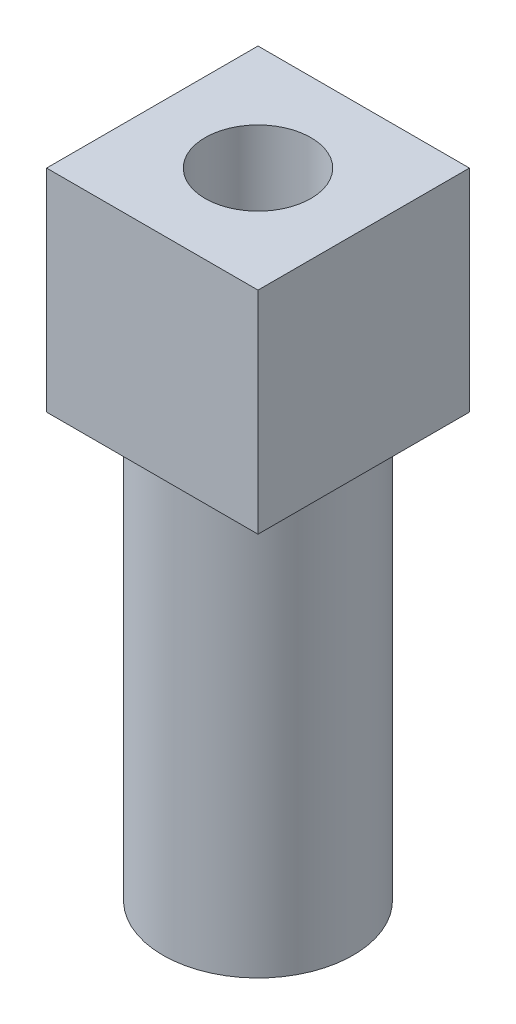
ISO-10303-21;
HEADER;
FILE_DESCRIPTION(('STEP AP214'),'2;1');
FILE_NAME('part.step','',(''),(''),'','','');
FILE_SCHEMA(('AUTOMOTIVE_DESIGN { 1 0 10303 214 1 1 1 1 }'));
ENDSEC;
DATA;
#1=APPLICATION_CONTEXT('core data for automotive mechanical design processes');
#2=APPLICATION_PROTOCOL_DEFINITION('international standard','automotive_design',2000,#1);
#3=PRODUCT_CONTEXT('',#1,'mechanical');
#4=PRODUCT('Part','Part','',(#3));
#5=PRODUCT_RELATED_PRODUCT_CATEGORY('part','',(#4));
#6=PRODUCT_DEFINITION_FORMATION('','',#4);
#7=PRODUCT_DEFINITION_CONTEXT('part definition',#1,'design');
#8=PRODUCT_DEFINITION('design','',#6,#7);
#9=PRODUCT_DEFINITION_SHAPE('','',#8);
#10=(LENGTH_UNIT() NAMED_UNIT(*) SI_UNIT(.MILLI.,.METRE.));
#11=(NAMED_UNIT(*) PLANE_ANGLE_UNIT() SI_UNIT($,.RADIAN.));
#12=(NAMED_UNIT(*) SI_UNIT($,.STERADIAN.) SOLID_ANGLE_UNIT());
#13=UNCERTAINTY_MEASURE_WITH_UNIT(LENGTH_MEASURE(1.E-05),#10,'distance_accuracy_value','');
#14=(GEOMETRIC_REPRESENTATION_CONTEXT(3) GLOBAL_UNCERTAINTY_ASSIGNED_CONTEXT((#13)) GLOBAL_UNIT_ASSIGNED_CONTEXT((#10,
#11,#12)) REPRESENTATION_CONTEXT('',''));
#15=CARTESIAN_POINT('',(0.,0.,0.));
#16=DIRECTION('',(0.,0.,1.));
#17=DIRECTION('',(1.,0.,0.));
#18=AXIS2_PLACEMENT_3D('',#15,#16,#17);
#19=CARTESIAN_POINT('',(0.,0.,0.));
#20=DIRECTION('',(0.,-1.,0.));
#21=DIRECTION('',(0.,0.,-1.));
#22=AXIS2_PLACEMENT_3D('',#19,#20,#21);
#23=PLANE('',#22);
#24=CARTESIAN_POINT('',(0.,0.,0.));
#25=DIRECTION('',(0.,1.,0.));
#26=DIRECTION('',(0.,0.,1.));
#27=AXIS2_PLACEMENT_3D('',#24,#25,#26);
#28=CIRCLE('',#27,2.5);
#29=CARTESIAN_POINT('',(0.,0.,2.5));
#30=VERTEX_POINT('',#29);
#31=EDGE_CURVE('E115',#30,#30,#28,.T.);
#32=ORIENTED_EDGE('',*,*,#31,.T.);
#33=EDGE_LOOP('',(#32));
#34=FACE_BOUND('',#33,.T.);
#35=CARTESIAN_POINT('',(0.,0.,0.));
#36=DIRECTION('',(0.,-1.,0.));
#37=DIRECTION('',(0.,0.,-1.));
#38=AXIS2_PLACEMENT_3D('',#35,#36,#37);
#39=CIRCLE('',#38,4.5);
#40=CARTESIAN_POINT('',(0.,0.,-4.5));
#41=VERTEX_POINT('',#40);
#42=EDGE_CURVE('E11',#41,#41,#39,.T.);
#43=ORIENTED_EDGE('',*,*,#42,.T.);
#44=EDGE_LOOP('',(#43));
#45=FACE_BOUND('',#44,.T.);
#46=ADVANCED_FACE('F39',(#34,#45),#23,.T.);
#47=CARTESIAN_POINT('',(0.,-2.45930268585907,0.));
#48=DIRECTION('',(0.,-1.,0.));
#49=DIRECTION('',(0.,0.,-1.));
#50=AXIS2_PLACEMENT_3D('',#47,#48,#49);
#51=CYLINDRICAL_SURFACE('',#50,4.5);
#52=CARTESIAN_POINT('',(0.,20.,0.));
#53=DIRECTION('',(0.,1.,0.));
#54=DIRECTION('',(0.,0.,1.));
#55=AXIS2_PLACEMENT_3D('',#52,#53,#54);
#56=CIRCLE('',#55,4.5);
#57=CARTESIAN_POINT('',(0.,20.,4.5));
#58=VERTEX_POINT('',#57);
#59=EDGE_CURVE('E48',#58,#58,#56,.F.);
#60=ORIENTED_EDGE('',*,*,#59,.T.);
#61=EDGE_LOOP('',(#60));
#62=FACE_BOUND('',#61,.T.);
#63=ORIENTED_EDGE('',*,*,#42,.F.);
#64=EDGE_LOOP('',(#63));
#65=FACE_BOUND('',#64,.T.);
#66=ADVANCED_FACE('F131',(#62,#65),#51,.T.);
#67=CARTESIAN_POINT('',(-5.,30.,-5.));
#68=DIRECTION('',(1.,0.,0.));
#69=DIRECTION('',(0.,0.,-1.));
#70=AXIS2_PLACEMENT_3D('',#67,#68,#69);
#71=PLANE('',#70);
#72=DIRECTION('',(0.,0.,1.));
#73=VECTOR('',#72,1.);
#74=CARTESIAN_POINT('',(-5.,20.,-5.));
#75=LINE('',#74,#73);
#76=CARTESIAN_POINT('',(-5.,20.,-5.));
#77=VERTEX_POINT('',#76);
#78=CARTESIAN_POINT('',(-5.,20.,5.));
#79=VERTEX_POINT('',#78);
#80=EDGE_CURVE('E111',#77,#79,#75,.T.);
#81=ORIENTED_EDGE('',*,*,#80,.T.);
#82=DIRECTION('',(0.,-1.,0.));
#83=VECTOR('',#82,1.);
#84=CARTESIAN_POINT('',(-5.,30.,5.));
#85=LINE('',#84,#83);
#86=CARTESIAN_POINT('',(-5.,30.,5.));
#87=VERTEX_POINT('',#86);
#88=EDGE_CURVE('E100',#87,#79,#85,.T.);
#89=ORIENTED_EDGE('',*,*,#88,.F.);
#90=DIRECTION('',(0.,0.,1.));
#91=VECTOR('',#90,1.);
#92=CARTESIAN_POINT('',(-5.,30.,-5.));
#93=LINE('',#92,#91);
#94=CARTESIAN_POINT('',(-5.,30.,-5.));
#95=VERTEX_POINT('',#94);
#96=EDGE_CURVE('E92',#95,#87,#93,.T.);
#97=ORIENTED_EDGE('',*,*,#96,.F.);
#98=DIRECTION('',(0.,-1.,0.));
#99=VECTOR('',#98,1.);
#100=CARTESIAN_POINT('',(-5.,30.,-5.));
#101=LINE('',#100,#99);
#102=EDGE_CURVE('E107',#95,#77,#101,.T.);
#103=ORIENTED_EDGE('',*,*,#102,.T.);
#104=EDGE_LOOP('',(#81,#89,#97,#103));
#105=FACE_BOUND('',#104,.T.);
#106=ADVANCED_FACE('F141',(#105),#71,.F.);
#107=CARTESIAN_POINT('',(-5.,30.,5.));
#108=DIRECTION('',(0.,0.,-1.));
#109=DIRECTION('',(-1.,0.,0.));
#110=AXIS2_PLACEMENT_3D('',#107,#108,#109);
#111=PLANE('',#110);
#112=DIRECTION('',(1.,0.,0.));
#113=VECTOR('',#112,1.);
#114=CARTESIAN_POINT('',(-5.,20.,5.));
#115=LINE('',#114,#113);
#116=CARTESIAN_POINT('',(5.,20.,5.));
#117=VERTEX_POINT('',#116);
#118=EDGE_CURVE('E98',#79,#117,#115,.T.);
#119=ORIENTED_EDGE('',*,*,#118,.T.);
#120=DIRECTION('',(0.,-1.,0.));
#121=VECTOR('',#120,1.);
#122=CARTESIAN_POINT('',(5.,30.,5.));
#123=LINE('',#122,#121);
#124=CARTESIAN_POINT('',(5.,30.,5.));
#125=VERTEX_POINT('',#124);
#126=EDGE_CURVE('E96',#125,#117,#123,.T.);
#127=ORIENTED_EDGE('',*,*,#126,.F.);
#128=DIRECTION('',(1.,0.,0.));
#129=VECTOR('',#128,1.);
#130=CARTESIAN_POINT('',(-5.,30.,5.));
#131=LINE('',#130,#129);
#132=EDGE_CURVE('E87',#87,#125,#131,.T.);
#133=ORIENTED_EDGE('',*,*,#132,.F.);
#134=ORIENTED_EDGE('',*,*,#88,.T.);
#135=EDGE_LOOP('',(#119,#127,#133,#134));
#136=FACE_BOUND('',#135,.T.);
#137=ADVANCED_FACE('F97',(#136),#111,.F.);
#138=CARTESIAN_POINT('',(5.,30.,-5.));
#139=DIRECTION('',(-1.,0.,0.));
#140=DIRECTION('',(0.,0.,1.));
#141=AXIS2_PLACEMENT_3D('',#138,#139,#140);
#142=PLANE('',#141);
#143=DIRECTION('',(0.,0.,-1.));
#144=VECTOR('',#143,1.);
#145=CARTESIAN_POINT('',(5.,20.,-5.));
#146=LINE('',#145,#144);
#147=CARTESIAN_POINT('',(5.,20.,-5.));
#148=VERTEX_POINT('',#147);
#149=EDGE_CURVE('E73',#117,#148,#146,.T.);
#150=ORIENTED_EDGE('',*,*,#149,.T.);
#151=DIRECTION('',(0.,-1.,0.));
#152=VECTOR('',#151,1.);
#153=CARTESIAN_POINT('',(5.,30.,-5.));
#154=LINE('',#153,#152);
#155=CARTESIAN_POINT('',(5.,30.,-5.));
#156=VERTEX_POINT('',#155);
#157=EDGE_CURVE('E101',#156,#148,#154,.T.);
#158=ORIENTED_EDGE('',*,*,#157,.F.);
#159=DIRECTION('',(0.,0.,-1.));
#160=VECTOR('',#159,1.);
#161=CARTESIAN_POINT('',(5.,30.,-5.));
#162=LINE('',#161,#160);
#163=EDGE_CURVE('E90',#125,#156,#162,.T.);
#164=ORIENTED_EDGE('',*,*,#163,.F.);
#165=ORIENTED_EDGE('',*,*,#126,.T.);
#166=EDGE_LOOP('',(#150,#158,#164,#165));
#167=FACE_BOUND('',#166,.T.);
#168=ADVANCED_FACE('F103',(#167),#142,.F.);
#169=CARTESIAN_POINT('',(-5.,30.,-5.));
#170=DIRECTION('',(0.,0.,1.));
#171=DIRECTION('',(1.,0.,0.));
#172=AXIS2_PLACEMENT_3D('',#169,#170,#171);
#173=PLANE('',#172);
#174=DIRECTION('',(-1.,0.,0.));
#175=VECTOR('',#174,1.);
#176=CARTESIAN_POINT('',(-5.,20.,-5.));
#177=LINE('',#176,#175);
#178=EDGE_CURVE('E79',#148,#77,#177,.T.);
#179=ORIENTED_EDGE('',*,*,#178,.T.);
#180=ORIENTED_EDGE('',*,*,#102,.F.);
#181=DIRECTION('',(-1.,0.,0.));
#182=VECTOR('',#181,1.);
#183=CARTESIAN_POINT('',(-5.,30.,-5.));
#184=LINE('',#183,#182);
#185=EDGE_CURVE('E56',#156,#95,#184,.T.);
#186=ORIENTED_EDGE('',*,*,#185,.F.);
#187=ORIENTED_EDGE('',*,*,#157,.T.);
#188=EDGE_LOOP('',(#179,#180,#186,#187));
#189=FACE_BOUND('',#188,.T.);
#190=ADVANCED_FACE('F142',(#189),#173,.F.);
#191=CARTESIAN_POINT('',(0.,30.,0.));
#192=DIRECTION('',(0.,1.,0.));
#193=DIRECTION('',(0.,0.,1.));
#194=AXIS2_PLACEMENT_3D('',#191,#192,#193);
#195=PLANE('',#194);
#196=CARTESIAN_POINT('',(0.,30.,0.));
#197=DIRECTION('',(0.,1.,0.));
#198=DIRECTION('',(0.,0.,1.));
#199=AXIS2_PLACEMENT_3D('',#196,#197,#198);
#200=CIRCLE('',#199,2.5);
#201=CARTESIAN_POINT('',(0.,30.,2.5));
#202=VERTEX_POINT('',#201);
#203=EDGE_CURVE('E163',#202,#202,#200,.T.);
#204=ORIENTED_EDGE('',*,*,#203,.F.);
#205=EDGE_LOOP('',(#204));
#206=FACE_BOUND('',#205,.T.);
#207=ORIENTED_EDGE('',*,*,#96,.T.);
#208=ORIENTED_EDGE('',*,*,#132,.T.);
#209=ORIENTED_EDGE('',*,*,#163,.T.);
#210=ORIENTED_EDGE('',*,*,#185,.T.);
#211=EDGE_LOOP('',(#207,#208,#209,#210));
#212=FACE_BOUND('',#211,.T.);
#213=ADVANCED_FACE('F88',(#206,#212),#195,.T.);
#214=CARTESIAN_POINT('',(0.,20.,0.));
#215=DIRECTION('',(0.,1.,0.));
#216=DIRECTION('',(0.,0.,1.));
#217=AXIS2_PLACEMENT_3D('',#214,#215,#216);
#218=PLANE('',#217);
#219=ORIENTED_EDGE('',*,*,#59,.F.);
#220=EDGE_LOOP('',(#219));
#221=FACE_BOUND('',#220,.T.);
#222=ORIENTED_EDGE('',*,*,#80,.F.);
#223=ORIENTED_EDGE('',*,*,#178,.F.);
#224=ORIENTED_EDGE('',*,*,#149,.F.);
#225=ORIENTED_EDGE('',*,*,#118,.F.);
#226=EDGE_LOOP('',(#222,#223,#224,#225));
#227=FACE_BOUND('',#226,.T.);
#228=ADVANCED_FACE('F134',(#221,#227),#218,.F.);
#229=CARTESIAN_POINT('',(0.,0.,0.));
#230=DIRECTION('',(0.,1.,0.));
#231=DIRECTION('',(0.,0.,1.));
#232=AXIS2_PLACEMENT_3D('',#229,#230,#231);
#233=CYLINDRICAL_SURFACE('',#232,2.5);
#234=ORIENTED_EDGE('',*,*,#31,.F.);
#235=EDGE_LOOP('',(#234));
#236=FACE_BOUND('',#235,.T.);
#237=ORIENTED_EDGE('',*,*,#203,.T.);
#238=EDGE_LOOP('',(#237));
#239=FACE_BOUND('',#238,.T.);
#240=ADVANCED_FACE('F137',(#236,#239),#233,.F.);
#241=CLOSED_SHELL('',(#46,#66,#106,#137,#168,#190,#213,#228,#240));
#242=MANIFOLD_SOLID_BREP('B2',#241);
#243=ADVANCED_BREP_SHAPE_REPRESENTATION('',(#18,#242),#14);
#244=SHAPE_DEFINITION_REPRESENTATION(#9,#243);
ENDSEC;
END-ISO-10303-21;
